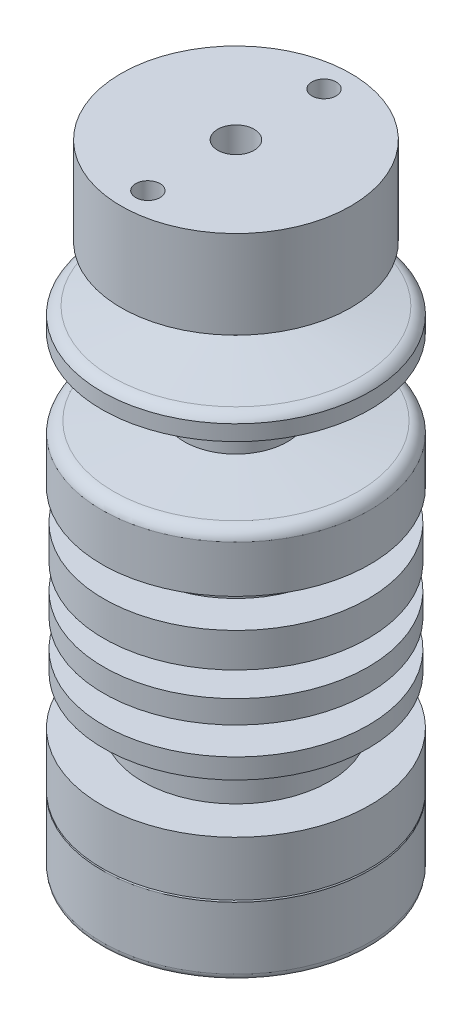
ISO-10303-21;
HEADER;
FILE_DESCRIPTION(('STEP AP214'),'2;1');
FILE_NAME('part.step','',(''),(''),'','','');
FILE_SCHEMA(('AUTOMOTIVE_DESIGN { 1 0 10303 214 1 1 1 1 }'));
ENDSEC;
DATA;
#1=APPLICATION_CONTEXT('core data for automotive mechanical design processes');
#2=APPLICATION_PROTOCOL_DEFINITION('international standard','automotive_design',2000,#1);
#3=PRODUCT_CONTEXT('',#1,'mechanical');
#4=PRODUCT('Part','Part','',(#3));
#5=PRODUCT_RELATED_PRODUCT_CATEGORY('part','',(#4));
#6=PRODUCT_DEFINITION_FORMATION('','',#4);
#7=PRODUCT_DEFINITION_CONTEXT('part definition',#1,'design');
#8=PRODUCT_DEFINITION('design','',#6,#7);
#9=PRODUCT_DEFINITION_SHAPE('','',#8);
#10=(LENGTH_UNIT() NAMED_UNIT(*) SI_UNIT(.MILLI.,.METRE.));
#11=(NAMED_UNIT(*) PLANE_ANGLE_UNIT() SI_UNIT($,.RADIAN.));
#12=(NAMED_UNIT(*) SI_UNIT($,.STERADIAN.) SOLID_ANGLE_UNIT());
#13=UNCERTAINTY_MEASURE_WITH_UNIT(LENGTH_MEASURE(1.E-05),#10,'distance_accuracy_value','');
#14=(GEOMETRIC_REPRESENTATION_CONTEXT(3) GLOBAL_UNCERTAINTY_ASSIGNED_CONTEXT((#13)) GLOBAL_UNIT_ASSIGNED_CONTEXT((#10,
#11,#12)) REPRESENTATION_CONTEXT('',''));
#15=CARTESIAN_POINT('',(0.,0.,0.));
#16=DIRECTION('',(0.,0.,1.));
#17=DIRECTION('',(1.,0.,0.));
#18=AXIS2_PLACEMENT_3D('',#15,#16,#17);
#19=CARTESIAN_POINT('',(0.,43.0445682451364,0.));
#20=DIRECTION('',(0.,-1.,0.));
#21=DIRECTION('',(1.,0.,0.));
#22=AXIS2_PLACEMENT_3D('',#19,#20,#21);
#23=PLANE('',#22);
#24=CARTESIAN_POINT('',(0.,43.0445682451364,0.));
#25=DIRECTION('',(0.,1.,0.));
#26=DIRECTION('',(-1.,0.,0.));
#27=AXIS2_PLACEMENT_3D('',#24,#25,#26);
#28=CIRCLE('',#27,4.765);
#29=CARTESIAN_POINT('',(-4.765,43.0445682451364,0.));
#30=VERTEX_POINT('',#29);
#31=EDGE_CURVE('E119',#30,#30,#28,.T.);
#32=ORIENTED_EDGE('',*,*,#31,.F.);
#33=EDGE_LOOP('',(#32));
#34=FACE_BOUND('',#33,.T.);
#35=CARTESIAN_POINT('',(0.,43.0445682451364,23.));
#36=DIRECTION('',(0.,1.,0.));
#37=DIRECTION('',(-1.,0.,0.));
#38=AXIS2_PLACEMENT_3D('',#35,#36,#37);
#39=CIRCLE('',#38,3.175);
#40=CARTESIAN_POINT('',(-3.17500000000001,43.0445682451364,23.));
#41=VERTEX_POINT('',#40);
#42=EDGE_CURVE('E123',#41,#41,#39,.T.);
#43=ORIENTED_EDGE('',*,*,#42,.F.);
#44=EDGE_LOOP('',(#43));
#45=FACE_BOUND('',#44,.T.);
#46=CARTESIAN_POINT('',(0.,43.0445682451364,-23.));
#47=DIRECTION('',(0.,1.,0.));
#48=DIRECTION('',(-1.,0.,0.));
#49=AXIS2_PLACEMENT_3D('',#46,#47,#48);
#50=CIRCLE('',#49,3.175);
#51=CARTESIAN_POINT('',(-3.17500000000001,43.0445682451364,-23.));
#52=VERTEX_POINT('',#51);
#53=EDGE_CURVE('E126',#52,#52,#50,.T.);
#54=ORIENTED_EDGE('',*,*,#53,.F.);
#55=EDGE_LOOP('',(#54));
#56=FACE_BOUND('',#55,.T.);
#57=CARTESIAN_POINT('',(0.,43.0445682451364,0.));
#58=DIRECTION('',(0.,1.,0.));
#59=DIRECTION('',(-1.,0.,0.));
#60=AXIS2_PLACEMENT_3D('',#57,#58,#59);
#61=CIRCLE('',#60,30.);
#62=CARTESIAN_POINT('',(-30.,43.0445682451364,0.));
#63=VERTEX_POINT('',#62);
#64=EDGE_CURVE('E10',#63,#63,#61,.T.);
#65=ORIENTED_EDGE('',*,*,#64,.T.);
#66=EDGE_LOOP('',(#65));
#67=FACE_BOUND('',#66,.T.);
#68=ADVANCED_FACE('F33',(#34,#45,#56,#67),#23,.F.);
#69=CARTESIAN_POINT('',(0.,43.0445682451364,0.));
#70=DIRECTION('',(0.,1.,0.));
#71=DIRECTION('',(-1.,0.,0.));
#72=AXIS2_PLACEMENT_3D('',#69,#70,#71);
#73=CYLINDRICAL_SURFACE('',#72,30.);
#74=ORIENTED_EDGE('',*,*,#64,.F.);
#75=EDGE_LOOP('',(#74));
#76=FACE_BOUND('',#75,.T.);
#77=CARTESIAN_POINT('',(0.,20.0445682451364,0.));
#78=DIRECTION('',(0.,1.,0.));
#79=DIRECTION('',(-1.,0.,0.));
#80=AXIS2_PLACEMENT_3D('',#77,#78,#79);
#81=CIRCLE('',#80,30.);
#82=CARTESIAN_POINT('',(-30.,20.0445682451364,0.));
#83=VERTEX_POINT('',#82);
#84=EDGE_CURVE('E40',#83,#83,#81,.T.);
#85=ORIENTED_EDGE('',*,*,#84,.T.);
#86=EDGE_LOOP('',(#85));
#87=FACE_BOUND('',#86,.T.);
#88=ADVANCED_FACE('F109',(#76,#87),#73,.T.);
#89=CARTESIAN_POINT('',(30.,20.0445682451364,0.));
#90=DIRECTION('',(0.,1.,0.));
#91=DIRECTION('',(-1.,0.,0.));
#92=AXIS2_PLACEMENT_3D('',#89,#90,#91);
#93=PLANE('',#92);
#94=ORIENTED_EDGE('',*,*,#84,.F.);
#95=EDGE_LOOP('',(#94));
#96=FACE_BOUND('',#95,.T.);
#97=CARTESIAN_POINT('',(0.,20.0445682451364,0.));
#98=DIRECTION('',(0.,1.,0.));
#99=DIRECTION('',(-1.,0.,0.));
#100=AXIS2_PLACEMENT_3D('',#97,#98,#99);
#101=CIRCLE('',#100,12.9857969124329);
#102=CARTESIAN_POINT('',(-12.9857969124329,20.0445682451364,0.));
#103=VERTEX_POINT('',#102);
#104=EDGE_CURVE('E45',#103,#103,#101,.T.);
#105=ORIENTED_EDGE('',*,*,#104,.T.);
#106=EDGE_LOOP('',(#105));
#107=FACE_BOUND('',#106,.T.);
#108=ADVANCED_FACE('F114',(#96,#107),#93,.F.);
#109=CARTESIAN_POINT('',(0.,43.0445682451364,0.));
#110=DIRECTION('',(0.,1.,0.));
#111=DIRECTION('',(-1.,0.,0.));
#112=AXIS2_PLACEMENT_3D('',#109,#110,#111);
#113=CYLINDRICAL_SURFACE('',#112,12.9857969124329);
#114=ORIENTED_EDGE('',*,*,#104,.F.);
#115=EDGE_LOOP('',(#114));
#116=FACE_BOUND('',#115,.T.);
#117=CARTESIAN_POINT('',(0.,10.4062076007876,0.));
#118=DIRECTION('',(0.,1.,0.));
#119=DIRECTION('',(-1.,0.,0.));
#120=AXIS2_PLACEMENT_3D('',#117,#118,#119);
#121=CIRCLE('',#120,12.9857969124329);
#122=CARTESIAN_POINT('',(-12.9857969124329,10.4062076007876,0.));
#123=VERTEX_POINT('',#122);
#124=EDGE_CURVE('E216',#123,#123,#121,.T.);
#125=ORIENTED_EDGE('',*,*,#124,.T.);
#126=EDGE_LOOP('',(#125));
#127=FACE_BOUND('',#126,.T.);
#128=ADVANCED_FACE('F222',(#116,#127),#113,.T.);
#129=CARTESIAN_POINT('',(0.,10.4062076007876,0.));
#130=DIRECTION('',(0.,1.,0.));
#131=DIRECTION('',(-1.,0.,0.));
#132=AXIS2_PLACEMENT_3D('',#129,#130,#131);
#133=TOROIDAL_SURFACE('',#132,15.8008154382432,2.81501852581031);
#134=ORIENTED_EDGE('',*,*,#124,.F.);
#135=EDGE_LOOP('',(#134));
#136=FACE_BOUND('',#135,.T.);
#137=CARTESIAN_POINT('',(0.,8.51251271153448,0.));
#138=DIRECTION('',(0.,1.,0.));
#139=DIRECTION('',(-1.,0.,0.));
#140=AXIS2_PLACEMENT_3D('',#137,#138,#139);
#141=CIRCLE('',#140,13.7179690763931);
#142=CARTESIAN_POINT('',(-13.7179690763931,8.51251271153447,0.));
#143=VERTEX_POINT('',#142);
#144=EDGE_CURVE('E213',#143,#143,#141,.T.);
#145=ORIENTED_EDGE('',*,*,#144,.T.);
#146=EDGE_LOOP('',(#145));
#147=FACE_BOUND('',#146,.T.);
#148=ADVANCED_FACE('F225',(#136,#147),#133,.F.);
#149=CARTESIAN_POINT('',(0.,5.48596194522862,0.));
#150=DIRECTION('',(0.,-1.,0.));
#151=DIRECTION('',(1.,0.,0.));
#152=AXIS2_PLACEMENT_3D('',#149,#150,#151);
#153=CONICAL_SURFACE('',#152,32.3097448153254,1.40942212691776);
#154=ORIENTED_EDGE('',*,*,#144,.F.);
#155=EDGE_LOOP('',(#154));
#156=FACE_BOUND('',#155,.T.);
#157=CARTESIAN_POINT('',(0.,5.48596194522862,0.));
#158=DIRECTION('',(0.,1.,0.));
#159=DIRECTION('',(-1.,0.,0.));
#160=AXIS2_PLACEMENT_3D('',#157,#158,#159);
#161=CIRCLE('',#160,32.3097448153254);
#162=CARTESIAN_POINT('',(-32.3097448153254,5.48596194522862,0.));
#163=VERTEX_POINT('',#162);
#164=EDGE_CURVE('E210',#163,#163,#161,.T.);
#165=ORIENTED_EDGE('',*,*,#164,.T.);
#166=EDGE_LOOP('',(#165));
#167=FACE_BOUND('',#166,.T.);
#168=ADVANCED_FACE('F231',(#156,#167),#153,.T.);
#169=CARTESIAN_POINT('',(0.,1.82897337850735,0.));
#170=DIRECTION('',(0.,1.,0.));
#171=DIRECTION('',(-1.,0.,0.));
#172=AXIS2_PLACEMENT_3D('',#169,#170,#171);
#173=TOROIDAL_SURFACE('',#172,31.714424513252,3.7051277493753);
#174=ORIENTED_EDGE('',*,*,#164,.F.);
#175=EDGE_LOOP('',(#174));
#176=FACE_BOUND('',#175,.T.);
#177=CARTESIAN_POINT('',(0.,3.54156362724511,0.));
#178=DIRECTION('',(0.,1.,0.));
#179=DIRECTION('',(-1.,0.,0.));
#180=AXIS2_PLACEMENT_3D('',#177,#178,#179);
#181=CIRCLE('',#180,35.);
#182=CARTESIAN_POINT('',(-35.,3.54156362724511,0.));
#183=VERTEX_POINT('',#182);
#184=EDGE_CURVE('E207',#183,#183,#181,.T.);
#185=ORIENTED_EDGE('',*,*,#184,.T.);
#186=EDGE_LOOP('',(#185));
#187=FACE_BOUND('',#186,.T.);
#188=ADVANCED_FACE('F237',(#176,#187),#173,.T.);
#189=CARTESIAN_POINT('',(0.,43.0445682451364,0.));
#190=DIRECTION('',(0.,1.,0.));
#191=DIRECTION('',(-1.,0.,0.));
#192=AXIS2_PLACEMENT_3D('',#189,#190,#191);
#193=CYLINDRICAL_SURFACE('',#192,35.);
#194=ORIENTED_EDGE('',*,*,#184,.F.);
#195=EDGE_LOOP('',(#194));
#196=FACE_BOUND('',#195,.T.);
#197=CARTESIAN_POINT('',(0.,-0.490098714239634,0.));
#198=DIRECTION('',(0.,1.,0.));
#199=DIRECTION('',(-1.,0.,0.));
#200=AXIS2_PLACEMENT_3D('',#197,#198,#199);
#201=CIRCLE('',#200,35.);
#202=CARTESIAN_POINT('',(-35.,-0.490098714239638,0.));
#203=VERTEX_POINT('',#202);
#204=EDGE_CURVE('E204',#203,#203,#201,.T.);
#205=ORIENTED_EDGE('',*,*,#204,.T.);
#206=EDGE_LOOP('',(#205));
#207=FACE_BOUND('',#206,.T.);
#208=ADVANCED_FACE('F243',(#196,#207),#193,.T.);
#209=CARTESIAN_POINT('',(13.4687354882585,-0.490098714239631,0.));
#210=DIRECTION('',(0.,1.,0.));
#211=DIRECTION('',(-1.,0.,0.));
#212=AXIS2_PLACEMENT_3D('',#209,#210,#211);
#213=PLANE('',#212);
#214=ORIENTED_EDGE('',*,*,#204,.F.);
#215=EDGE_LOOP('',(#214));
#216=FACE_BOUND('',#215,.T.);
#217=CARTESIAN_POINT('',(0.,-0.490098714239634,0.));
#218=DIRECTION('',(0.,1.,0.));
#219=DIRECTION('',(-1.,0.,0.));
#220=AXIS2_PLACEMENT_3D('',#217,#218,#219);
#221=CIRCLE('',#220,13.4687354882585);
#222=CARTESIAN_POINT('',(-13.4687354882585,-0.490098714239636,0.));
#223=VERTEX_POINT('',#222);
#224=EDGE_CURVE('E201',#223,#223,#221,.T.);
#225=ORIENTED_EDGE('',*,*,#224,.T.);
#226=EDGE_LOOP('',(#225));
#227=FACE_BOUND('',#226,.T.);
#228=ADVANCED_FACE('F249',(#216,#227),#213,.F.);
#229=CARTESIAN_POINT('',(0.,43.0445682451364,0.));
#230=DIRECTION('',(0.,1.,0.));
#231=DIRECTION('',(-1.,0.,0.));
#232=AXIS2_PLACEMENT_3D('',#229,#230,#231);
#233=CYLINDRICAL_SURFACE('',#232,13.4687354882585);
#234=ORIENTED_EDGE('',*,*,#224,.F.);
#235=EDGE_LOOP('',(#234));
#236=FACE_BOUND('',#235,.T.);
#237=CARTESIAN_POINT('',(0.,-18.538757945872,0.));
#238=DIRECTION('',(0.,1.,0.));
#239=DIRECTION('',(-1.,0.,0.));
#240=AXIS2_PLACEMENT_3D('',#237,#238,#239);
#241=CIRCLE('',#240,13.4687354882585);
#242=CARTESIAN_POINT('',(-13.4687354882585,-18.538757945872,0.));
#243=VERTEX_POINT('',#242);
#244=EDGE_CURVE('E198',#243,#243,#241,.T.);
#245=ORIENTED_EDGE('',*,*,#244,.T.);
#246=EDGE_LOOP('',(#245));
#247=FACE_BOUND('',#246,.T.);
#248=ADVANCED_FACE('F255',(#236,#247),#233,.T.);
#249=CARTESIAN_POINT('',(0.,-20.5131962872159,0.));
#250=DIRECTION('',(0.,-1.,0.));
#251=DIRECTION('',(1.,0.,0.));
#252=AXIS2_PLACEMENT_3D('',#249,#250,#251);
#253=CONICAL_SURFACE('',#252,31.9792266270137,1.46453221422253);
#254=ORIENTED_EDGE('',*,*,#244,.F.);
#255=EDGE_LOOP('',(#254));
#256=FACE_BOUND('',#255,.T.);
#257=CARTESIAN_POINT('',(0.,-20.5131962872159,0.));
#258=DIRECTION('',(0.,1.,0.));
#259=DIRECTION('',(-1.,0.,0.));
#260=AXIS2_PLACEMENT_3D('',#257,#258,#259);
#261=CIRCLE('',#260,31.9792266270137);
#262=CARTESIAN_POINT('',(-31.9792266270137,-20.5131962872159,0.));
#263=VERTEX_POINT('',#262);
#264=EDGE_CURVE('E195',#263,#263,#261,.T.);
#265=ORIENTED_EDGE('',*,*,#264,.T.);
#266=EDGE_LOOP('',(#265));
#267=FACE_BOUND('',#266,.T.);
#268=ADVANCED_FACE('F261',(#256,#267),#253,.T.);
#269=CARTESIAN_POINT('',(0.,-23.9615059492109,0.));
#270=DIRECTION('',(0.,1.,0.));
#271=DIRECTION('',(-1.,0.,0.));
#272=AXIS2_PLACEMENT_3D('',#269,#270,#271);
#273=TOROIDAL_SURFACE('',#272,31.6114095465033,3.46787095055789);
#274=ORIENTED_EDGE('',*,*,#264,.F.);
#275=EDGE_LOOP('',(#274));
#276=FACE_BOUND('',#275,.T.);
#277=CARTESIAN_POINT('',(0.,-23.2242246811764,0.));
#278=DIRECTION('',(0.,1.,0.));
#279=DIRECTION('',(-1.,0.,0.));
#280=AXIS2_PLACEMENT_3D('',#277,#278,#279);
#281=CIRCLE('',#280,35.);
#282=CARTESIAN_POINT('',(-35.,-23.2242246811764,0.));
#283=VERTEX_POINT('',#282);
#284=EDGE_CURVE('E192',#283,#283,#281,.T.);
#285=ORIENTED_EDGE('',*,*,#284,.T.);
#286=EDGE_LOOP('',(#285));
#287=FACE_BOUND('',#286,.T.);
#288=ADVANCED_FACE('F267',(#276,#287),#273,.T.);
#289=CARTESIAN_POINT('',(0.,43.0445682451364,0.));
#290=DIRECTION('',(0.,1.,0.));
#291=DIRECTION('',(-1.,0.,0.));
#292=AXIS2_PLACEMENT_3D('',#289,#290,#291);
#293=CYLINDRICAL_SURFACE('',#292,35.);
#294=ORIENTED_EDGE('',*,*,#284,.F.);
#295=EDGE_LOOP('',(#294));
#296=FACE_BOUND('',#295,.T.);
#297=CARTESIAN_POINT('',(0.,-35.501069654203,0.));
#298=DIRECTION('',(0.,1.,0.));
#299=DIRECTION('',(-1.,0.,0.));
#300=AXIS2_PLACEMENT_3D('',#297,#298,#299);
#301=CIRCLE('',#300,35.);
#302=CARTESIAN_POINT('',(-35.,-35.501069654203,0.));
#303=VERTEX_POINT('',#302);
#304=EDGE_CURVE('E189',#303,#303,#301,.T.);
#305=ORIENTED_EDGE('',*,*,#304,.T.);
#306=EDGE_LOOP('',(#305));
#307=FACE_BOUND('',#306,.T.);
#308=ADVANCED_FACE('F273',(#296,#307),#293,.T.);
#309=CARTESIAN_POINT('',(35.,-35.501069654203,0.));
#310=DIRECTION('',(0.,1.,0.));
#311=DIRECTION('',(-1.,0.,0.));
#312=AXIS2_PLACEMENT_3D('',#309,#310,#311);
#313=PLANE('',#312);
#314=ORIENTED_EDGE('',*,*,#304,.F.);
#315=EDGE_LOOP('',(#314));
#316=FACE_BOUND('',#315,.T.);
#317=CARTESIAN_POINT('',(0.,-35.501069654203,0.));
#318=DIRECTION('',(0.,1.,0.));
#319=DIRECTION('',(-1.,0.,0.));
#320=AXIS2_PLACEMENT_3D('',#317,#318,#319);
#321=CIRCLE('',#320,24.3346955919766);
#322=CARTESIAN_POINT('',(-24.3346955919766,-35.501069654203,0.));
#323=VERTEX_POINT('',#322);
#324=EDGE_CURVE('E186',#323,#323,#321,.T.);
#325=ORIENTED_EDGE('',*,*,#324,.T.);
#326=EDGE_LOOP('',(#325));
#327=FACE_BOUND('',#326,.T.);
#328=ADVANCED_FACE('F279',(#316,#327),#313,.F.);
#329=CARTESIAN_POINT('',(0.,43.0445682451364,0.));
#330=DIRECTION('',(0.,1.,0.));
#331=DIRECTION('',(-1.,0.,0.));
#332=AXIS2_PLACEMENT_3D('',#329,#330,#331);
#333=CYLINDRICAL_SURFACE('',#332,24.3346955919766);
#334=ORIENTED_EDGE('',*,*,#324,.F.);
#335=EDGE_LOOP('',(#334));
#336=FACE_BOUND('',#335,.T.);
#337=CARTESIAN_POINT('',(0.,-43.5201302921998,0.));
#338=DIRECTION('',(0.,1.,0.));
#339=DIRECTION('',(-1.,0.,0.));
#340=AXIS2_PLACEMENT_3D('',#337,#338,#339);
#341=CIRCLE('',#340,24.3346955919766);
#342=CARTESIAN_POINT('',(-24.3346955919766,-43.5201302921998,0.));
#343=VERTEX_POINT('',#342);
#344=EDGE_CURVE('E183',#343,#343,#341,.T.);
#345=ORIENTED_EDGE('',*,*,#344,.T.);
#346=EDGE_LOOP('',(#345));
#347=FACE_BOUND('',#346,.T.);
#348=ADVANCED_FACE('F285',(#336,#347),#333,.T.);
#349=CARTESIAN_POINT('',(34.5383420831025,-43.5201302921998,0.));
#350=DIRECTION('',(0.,-1.,0.));
#351=DIRECTION('',(1.,0.,0.));
#352=AXIS2_PLACEMENT_3D('',#349,#350,#351);
#353=PLANE('',#352);
#354=ORIENTED_EDGE('',*,*,#344,.F.);
#355=EDGE_LOOP('',(#354));
#356=FACE_BOUND('',#355,.T.);
#357=CARTESIAN_POINT('',(0.,-43.5201302921998,0.));
#358=DIRECTION('',(0.,1.,0.));
#359=DIRECTION('',(-1.,0.,0.));
#360=AXIS2_PLACEMENT_3D('',#357,#358,#359);
#361=CIRCLE('',#360,34.5383420831025);
#362=CARTESIAN_POINT('',(-34.5383420831025,-43.5201302921998,0.));
#363=VERTEX_POINT('',#362);
#364=EDGE_CURVE('E180',#363,#363,#361,.T.);
#365=ORIENTED_EDGE('',*,*,#364,.T.);
#366=EDGE_LOOP('',(#365));
#367=FACE_BOUND('',#366,.T.);
#368=ADVANCED_FACE('F291',(#356,#367),#353,.F.);
#369=CARTESIAN_POINT('',(0.,43.0445682451364,0.));
#370=DIRECTION('',(0.,1.,0.));
#371=DIRECTION('',(-1.,0.,0.));
#372=AXIS2_PLACEMENT_3D('',#369,#370,#371);
#373=CYLINDRICAL_SURFACE('',#372,34.5383420831025);
#374=ORIENTED_EDGE('',*,*,#364,.F.);
#375=EDGE_LOOP('',(#374));
#376=FACE_BOUND('',#375,.T.);
#377=CARTESIAN_POINT('',(0.,-52.4771427984482,0.));
#378=DIRECTION('',(0.,1.,0.));
#379=DIRECTION('',(-1.,0.,0.));
#380=AXIS2_PLACEMENT_3D('',#377,#378,#379);
#381=CIRCLE('',#380,34.5383420831025);
#382=CARTESIAN_POINT('',(-34.5383420831025,-52.4771427984482,0.));
#383=VERTEX_POINT('',#382);
#384=EDGE_CURVE('E177',#383,#383,#381,.T.);
#385=ORIENTED_EDGE('',*,*,#384,.T.);
#386=EDGE_LOOP('',(#385));
#387=FACE_BOUND('',#386,.T.);
#388=ADVANCED_FACE('F297',(#376,#387),#373,.T.);
#389=CARTESIAN_POINT('',(24.3346955919766,-52.4771427984482,0.));
#390=DIRECTION('',(0.,1.,0.));
#391=DIRECTION('',(-1.,0.,0.));
#392=AXIS2_PLACEMENT_3D('',#389,#390,#391);
#393=PLANE('',#392);
#394=ORIENTED_EDGE('',*,*,#384,.F.);
#395=EDGE_LOOP('',(#394));
#396=FACE_BOUND('',#395,.T.);
#397=CARTESIAN_POINT('',(0.,-52.4771427984482,0.));
#398=DIRECTION('',(0.,1.,0.));
#399=DIRECTION('',(-1.,0.,0.));
#400=AXIS2_PLACEMENT_3D('',#397,#398,#399);
#401=CIRCLE('',#400,24.3346955919766);
#402=CARTESIAN_POINT('',(-24.3346955919766,-52.4771427984482,0.));
#403=VERTEX_POINT('',#402);
#404=EDGE_CURVE('E174',#403,#403,#401,.T.);
#405=ORIENTED_EDGE('',*,*,#404,.T.);
#406=EDGE_LOOP('',(#405));
#407=FACE_BOUND('',#406,.T.);
#408=ADVANCED_FACE('F303',(#396,#407),#393,.F.);
#409=CARTESIAN_POINT('',(0.,43.0445682451364,0.));
#410=DIRECTION('',(0.,1.,0.));
#411=DIRECTION('',(-1.,0.,0.));
#412=AXIS2_PLACEMENT_3D('',#409,#410,#411);
#413=CYLINDRICAL_SURFACE('',#412,24.3346955919766);
#414=ORIENTED_EDGE('',*,*,#404,.F.);
#415=EDGE_LOOP('',(#414));
#416=FACE_BOUND('',#415,.T.);
#417=CARTESIAN_POINT('',(0.,-58.9460962751831,0.));
#418=DIRECTION('',(0.,1.,0.));
#419=DIRECTION('',(-1.,0.,0.));
#420=AXIS2_PLACEMENT_3D('',#417,#418,#419);
#421=CIRCLE('',#420,24.3346955919766);
#422=CARTESIAN_POINT('',(-24.3346955919766,-58.9460962751831,0.));
#423=VERTEX_POINT('',#422);
#424=EDGE_CURVE('E171',#423,#423,#421,.T.);
#425=ORIENTED_EDGE('',*,*,#424,.T.);
#426=EDGE_LOOP('',(#425));
#427=FACE_BOUND('',#426,.T.);
#428=ADVANCED_FACE('F309',(#416,#427),#413,.T.);
#429=CARTESIAN_POINT('',(34.5383420831025,-58.9460962751831,0.));
#430=DIRECTION('',(0.,-1.,0.));
#431=DIRECTION('',(1.,0.,0.));
#432=AXIS2_PLACEMENT_3D('',#429,#430,#431);
#433=PLANE('',#432);
#434=ORIENTED_EDGE('',*,*,#424,.F.);
#435=EDGE_LOOP('',(#434));
#436=FACE_BOUND('',#435,.T.);
#437=CARTESIAN_POINT('',(0.,-58.9460962751831,0.));
#438=DIRECTION('',(0.,1.,0.));
#439=DIRECTION('',(-1.,0.,0.));
#440=AXIS2_PLACEMENT_3D('',#437,#438,#439);
#441=CIRCLE('',#440,34.5383420831025);
#442=CARTESIAN_POINT('',(-34.5383420831025,-58.9460962751831,0.));
#443=VERTEX_POINT('',#442);
#444=EDGE_CURVE('E168',#443,#443,#441,.T.);
#445=ORIENTED_EDGE('',*,*,#444,.T.);
#446=EDGE_LOOP('',(#445));
#447=FACE_BOUND('',#446,.T.);
#448=ADVANCED_FACE('F315',(#436,#447),#433,.F.);
#449=CARTESIAN_POINT('',(0.,43.0445682451364,0.));
#450=DIRECTION('',(0.,1.,0.));
#451=DIRECTION('',(-1.,0.,0.));
#452=AXIS2_PLACEMENT_3D('',#449,#450,#451);
#453=CYLINDRICAL_SURFACE('',#452,34.5383420831025);
#454=ORIENTED_EDGE('',*,*,#444,.F.);
#455=EDGE_LOOP('',(#454));
#456=FACE_BOUND('',#455,.T.);
#457=CARTESIAN_POINT('',(0.,-64.9174379460154,0.));
#458=DIRECTION('',(0.,1.,0.));
#459=DIRECTION('',(-1.,0.,0.));
#460=AXIS2_PLACEMENT_3D('',#457,#458,#459);
#461=CIRCLE('',#460,34.5383420831025);
#462=CARTESIAN_POINT('',(-34.5383420831025,-64.9174379460154,0.));
#463=VERTEX_POINT('',#462);
#464=EDGE_CURVE('E165',#463,#463,#461,.T.);
#465=ORIENTED_EDGE('',*,*,#464,.T.);
#466=EDGE_LOOP('',(#465));
#467=FACE_BOUND('',#466,.T.);
#468=ADVANCED_FACE('F321',(#456,#467),#453,.T.);
#469=CARTESIAN_POINT('',(24.3346955919766,-64.9174379460154,0.));
#470=DIRECTION('',(0.,1.,0.));
#471=DIRECTION('',(-1.,0.,0.));
#472=AXIS2_PLACEMENT_3D('',#469,#470,#471);
#473=PLANE('',#472);
#474=ORIENTED_EDGE('',*,*,#464,.F.);
#475=EDGE_LOOP('',(#474));
#476=FACE_BOUND('',#475,.T.);
#477=CARTESIAN_POINT('',(0.,-64.9174379460154,0.));
#478=DIRECTION('',(0.,1.,0.));
#479=DIRECTION('',(-1.,0.,0.));
#480=AXIS2_PLACEMENT_3D('',#477,#478,#479);
#481=CIRCLE('',#480,24.3346955919766);
#482=CARTESIAN_POINT('',(-24.3346955919766,-64.9174379460154,0.));
#483=VERTEX_POINT('',#482);
#484=EDGE_CURVE('E162',#483,#483,#481,.T.);
#485=ORIENTED_EDGE('',*,*,#484,.T.);
#486=EDGE_LOOP('',(#485));
#487=FACE_BOUND('',#486,.T.);
#488=ADVANCED_FACE('F327',(#476,#487),#473,.F.);
#489=CARTESIAN_POINT('',(0.,43.0445682451364,0.));
#490=DIRECTION('',(0.,1.,0.));
#491=DIRECTION('',(-1.,0.,0.));
#492=AXIS2_PLACEMENT_3D('',#489,#490,#491);
#493=CYLINDRICAL_SURFACE('',#492,24.3346955919766);
#494=ORIENTED_EDGE('',*,*,#484,.F.);
#495=EDGE_LOOP('',(#494));
#496=FACE_BOUND('',#495,.T.);
#497=CARTESIAN_POINT('',(0.,-72.1328091316043,0.));
#498=DIRECTION('',(0.,1.,0.));
#499=DIRECTION('',(-1.,0.,0.));
#500=AXIS2_PLACEMENT_3D('',#497,#498,#499);
#501=CIRCLE('',#500,24.3346955919766);
#502=CARTESIAN_POINT('',(-24.3346955919766,-72.1328091316043,0.));
#503=VERTEX_POINT('',#502);
#504=EDGE_CURVE('E159',#503,#503,#501,.T.);
#505=ORIENTED_EDGE('',*,*,#504,.T.);
#506=EDGE_LOOP('',(#505));
#507=FACE_BOUND('',#506,.T.);
#508=ADVANCED_FACE('F333',(#496,#507),#493,.T.);
#509=CARTESIAN_POINT('',(34.5383420831025,-72.1328091316043,0.));
#510=DIRECTION('',(0.,-1.,0.));
#511=DIRECTION('',(1.,0.,0.));
#512=AXIS2_PLACEMENT_3D('',#509,#510,#511);
#513=PLANE('',#512);
#514=ORIENTED_EDGE('',*,*,#504,.F.);
#515=EDGE_LOOP('',(#514));
#516=FACE_BOUND('',#515,.T.);
#517=CARTESIAN_POINT('',(0.,-72.1328091316043,0.));
#518=DIRECTION('',(0.,1.,0.));
#519=DIRECTION('',(-1.,0.,0.));
#520=AXIS2_PLACEMENT_3D('',#517,#518,#519);
#521=CIRCLE('',#520,34.5383420831025);
#522=CARTESIAN_POINT('',(-34.5383420831025,-72.1328091316043,0.));
#523=VERTEX_POINT('',#522);
#524=EDGE_CURVE('E156',#523,#523,#521,.T.);
#525=ORIENTED_EDGE('',*,*,#524,.T.);
#526=EDGE_LOOP('',(#525));
#527=FACE_BOUND('',#526,.T.);
#528=ADVANCED_FACE('F339',(#516,#527),#513,.F.);
#529=CARTESIAN_POINT('',(0.,43.0445682451364,0.));
#530=DIRECTION('',(0.,1.,0.));
#531=DIRECTION('',(-1.,0.,0.));
#532=AXIS2_PLACEMENT_3D('',#529,#530,#531);
#533=CYLINDRICAL_SURFACE('',#532,34.5383420831025);
#534=ORIENTED_EDGE('',*,*,#524,.F.);
#535=EDGE_LOOP('',(#534));
#536=FACE_BOUND('',#535,.T.);
#537=CARTESIAN_POINT('',(0.,-77.3577330935826,0.));
#538=DIRECTION('',(0.,1.,0.));
#539=DIRECTION('',(-1.,0.,0.));
#540=AXIS2_PLACEMENT_3D('',#537,#538,#539);
#541=CIRCLE('',#540,34.5383420831025);
#542=CARTESIAN_POINT('',(-34.5383420831025,-77.3577330935826,0.));
#543=VERTEX_POINT('',#542);
#544=EDGE_CURVE('E153',#543,#543,#541,.T.);
#545=ORIENTED_EDGE('',*,*,#544,.T.);
#546=EDGE_LOOP('',(#545));
#547=FACE_BOUND('',#546,.T.);
#548=ADVANCED_FACE('F345',(#536,#547),#533,.T.);
#549=CARTESIAN_POINT('',(24.3346955919766,-77.3577330935826,0.));
#550=DIRECTION('',(0.,1.,0.));
#551=DIRECTION('',(-1.,0.,0.));
#552=AXIS2_PLACEMENT_3D('',#549,#550,#551);
#553=PLANE('',#552);
#554=ORIENTED_EDGE('',*,*,#544,.F.);
#555=EDGE_LOOP('',(#554));
#556=FACE_BOUND('',#555,.T.);
#557=CARTESIAN_POINT('',(0.,-77.3577330935826,0.));
#558=DIRECTION('',(0.,1.,0.));
#559=DIRECTION('',(-1.,0.,0.));
#560=AXIS2_PLACEMENT_3D('',#557,#558,#559);
#561=CIRCLE('',#560,24.3346955919766);
#562=CARTESIAN_POINT('',(-24.3346955919766,-77.3577330935826,0.));
#563=VERTEX_POINT('',#562);
#564=EDGE_CURVE('E150',#563,#563,#561,.T.);
#565=ORIENTED_EDGE('',*,*,#564,.T.);
#566=EDGE_LOOP('',(#565));
#567=FACE_BOUND('',#566,.T.);
#568=ADVANCED_FACE('F351',(#556,#567),#553,.F.);
#569=CARTESIAN_POINT('',(0.,43.0445682451364,0.));
#570=DIRECTION('',(0.,1.,0.));
#571=DIRECTION('',(-1.,0.,0.));
#572=AXIS2_PLACEMENT_3D('',#569,#570,#571);
#573=CYLINDRICAL_SURFACE('',#572,24.3346955919766);
#574=CARTESIAN_POINT('',(0.,-89.9816680736034,0.));
#575=DIRECTION('',(0.,1.,0.));
#576=DIRECTION('',(-1.,0.,0.));
#577=AXIS2_PLACEMENT_3D('',#574,#575,#576);
#578=CIRCLE('',#577,24.3346955919766);
#579=CARTESIAN_POINT('',(-24.3346955919766,-89.9816680736034,0.));
#580=VERTEX_POINT('',#579);
#581=EDGE_CURVE('E36',#580,#580,#578,.T.);
#582=ORIENTED_EDGE('',*,*,#581,.T.);
#583=EDGE_LOOP('',(#582));
#584=FACE_BOUND('',#583,.T.);
#585=ORIENTED_EDGE('',*,*,#564,.F.);
#586=EDGE_LOOP('',(#585));
#587=FACE_BOUND('',#586,.T.);
#588=ADVANCED_FACE('F73',(#584,#587),#573,.T.);
#589=CARTESIAN_POINT('',(0.,25.0445682451364,-23.));
#590=DIRECTION('',(0.,1.,0.));
#591=DIRECTION('',(-1.,0.,0.));
#592=AXIS2_PLACEMENT_3D('',#589,#590,#591);
#593=CYLINDRICAL_SURFACE('',#592,3.175);
#594=CARTESIAN_POINT('',(0.,25.0445682451364,-23.));
#595=DIRECTION('',(0.,1.,0.));
#596=DIRECTION('',(-1.,0.,0.));
#597=AXIS2_PLACEMENT_3D('',#594,#595,#596);
#598=CIRCLE('',#597,3.175);
#599=CARTESIAN_POINT('',(-3.175,25.0445682451364,-23.));
#600=VERTEX_POINT('',#599);
#601=EDGE_CURVE('E128',#600,#600,#598,.T.);
#602=ORIENTED_EDGE('',*,*,#601,.F.);
#603=EDGE_LOOP('',(#602));
#604=FACE_BOUND('',#603,.T.);
#605=ORIENTED_EDGE('',*,*,#53,.T.);
#606=EDGE_LOOP('',(#605));
#607=FACE_BOUND('',#606,.T.);
#608=ADVANCED_FACE('F69',(#604,#607),#593,.F.);
#609=CARTESIAN_POINT('',(0.,25.0445682451364,-23.));
#610=DIRECTION('',(0.,1.,0.));
#611=DIRECTION('',(-1.,0.,0.));
#612=AXIS2_PLACEMENT_3D('',#609,#610,#611);
#613=PLANE('',#612);
#614=ORIENTED_EDGE('',*,*,#601,.T.);
#615=EDGE_LOOP('',(#614));
#616=FACE_BOUND('',#615,.T.);
#617=ADVANCED_FACE('F72',(#616),#613,.T.);
#618=CARTESIAN_POINT('',(0.,25.0445682451364,23.));
#619=DIRECTION('',(0.,1.,0.));
#620=DIRECTION('',(-1.,0.,0.));
#621=AXIS2_PLACEMENT_3D('',#618,#619,#620);
#622=CYLINDRICAL_SURFACE('',#621,3.175);
#623=CARTESIAN_POINT('',(0.,25.0445682451364,23.));
#624=DIRECTION('',(0.,1.,0.));
#625=DIRECTION('',(-1.,0.,0.));
#626=AXIS2_PLACEMENT_3D('',#623,#624,#625);
#627=CIRCLE('',#626,3.175);
#628=CARTESIAN_POINT('',(-3.175,25.0445682451364,23.));
#629=VERTEX_POINT('',#628);
#630=EDGE_CURVE('E129',#629,#629,#627,.T.);
#631=ORIENTED_EDGE('',*,*,#630,.F.);
#632=EDGE_LOOP('',(#631));
#633=FACE_BOUND('',#632,.T.);
#634=ORIENTED_EDGE('',*,*,#42,.T.);
#635=EDGE_LOOP('',(#634));
#636=FACE_BOUND('',#635,.T.);
#637=ADVANCED_FACE('F77',(#633,#636),#622,.F.);
#638=CARTESIAN_POINT('',(0.,25.0445682451364,23.));
#639=DIRECTION('',(0.,1.,0.));
#640=DIRECTION('',(-1.,0.,0.));
#641=AXIS2_PLACEMENT_3D('',#638,#639,#640);
#642=PLANE('',#641);
#643=ORIENTED_EDGE('',*,*,#630,.T.);
#644=EDGE_LOOP('',(#643));
#645=FACE_BOUND('',#644,.T.);
#646=ADVANCED_FACE('F81',(#645),#642,.T.);
#647=CARTESIAN_POINT('',(0.,8.04456824513636,0.));
#648=DIRECTION('',(0.,1.,0.));
#649=DIRECTION('',(-1.,0.,0.));
#650=AXIS2_PLACEMENT_3D('',#647,#648,#649);
#651=CYLINDRICAL_SURFACE('',#650,4.765);
#652=CARTESIAN_POINT('',(0.,8.04456824513636,0.));
#653=DIRECTION('',(0.,1.,0.));
#654=DIRECTION('',(-1.,0.,0.));
#655=AXIS2_PLACEMENT_3D('',#652,#653,#654);
#656=CIRCLE('',#655,4.765);
#657=CARTESIAN_POINT('',(-4.765,8.04456824513636,0.));
#658=VERTEX_POINT('',#657);
#659=EDGE_CURVE('E642',#658,#658,#656,.T.);
#660=ORIENTED_EDGE('',*,*,#659,.F.);
#661=EDGE_LOOP('',(#660));
#662=FACE_BOUND('',#661,.T.);
#663=ORIENTED_EDGE('',*,*,#31,.T.);
#664=EDGE_LOOP('',(#663));
#665=FACE_BOUND('',#664,.T.);
#666=ADVANCED_FACE('F85',(#662,#665),#651,.F.);
#667=CARTESIAN_POINT('',(0.,8.04456824513636,0.));
#668=DIRECTION('',(0.,1.,0.));
#669=DIRECTION('',(-1.,0.,0.));
#670=AXIS2_PLACEMENT_3D('',#667,#668,#669);
#671=PLANE('',#670);
#672=ORIENTED_EDGE('',*,*,#659,.T.);
#673=EDGE_LOOP('',(#672));
#674=FACE_BOUND('',#673,.T.);
#675=ADVANCED_FACE('F89',(#674),#671,.T.);
#676=CARTESIAN_POINT('',(0.,-104.221668073603,0.));
#677=DIRECTION('',(0.,1.,0.));
#678=DIRECTION('',(-1.,0.,0.));
#679=AXIS2_PLACEMENT_3D('',#676,#677,#678);
#680=PLANE('',#679);
#681=CARTESIAN_POINT('',(0.,-104.221668073603,0.));
#682=DIRECTION('',(0.,1.,0.));
#683=DIRECTION('',(-1.,0.,0.));
#684=AXIS2_PLACEMENT_3D('',#681,#682,#683);
#685=CIRCLE('',#684,35.);
#686=CARTESIAN_POINT('',(-35.,-104.221668073603,0.));
#687=VERTEX_POINT('',#686);
#688=EDGE_CURVE('E645',#687,#687,#685,.T.);
#689=ORIENTED_EDGE('',*,*,#688,.F.);
#690=EDGE_LOOP('',(#689));
#691=FACE_BOUND('',#690,.T.);
#692=CARTESIAN_POINT('',(0.,-104.221668073603,0.));
#693=DIRECTION('',(0.,1.,0.));
#694=DIRECTION('',(-1.,0.,0.));
#695=AXIS2_PLACEMENT_3D('',#692,#693,#694);
#696=CIRCLE('',#695,34.5383420831025);
#697=CARTESIAN_POINT('',(-34.5383420831024,-104.221668073603,0.));
#698=VERTEX_POINT('',#697);
#699=EDGE_CURVE('E147',#698,#698,#696,.T.);
#700=ORIENTED_EDGE('',*,*,#699,.T.);
#701=EDGE_LOOP('',(#700));
#702=FACE_BOUND('',#701,.T.);
#703=ADVANCED_FACE('F93',(#691,#702),#680,.F.);
#704=CARTESIAN_POINT('',(0.,-89.9816680736034,0.));
#705=DIRECTION('',(0.,-1.,0.));
#706=DIRECTION('',(1.,0.,0.));
#707=AXIS2_PLACEMENT_3D('',#704,#705,#706);
#708=CYLINDRICAL_SURFACE('',#707,35.);
#709=CARTESIAN_POINT('',(0.,-89.9816680736034,0.));
#710=DIRECTION('',(0.,1.,0.));
#711=DIRECTION('',(-1.,0.,0.));
#712=AXIS2_PLACEMENT_3D('',#709,#710,#711);
#713=CIRCLE('',#712,35.);
#714=CARTESIAN_POINT('',(-35.,-89.9816680736034,0.));
#715=VERTEX_POINT('',#714);
#716=EDGE_CURVE('E641',#715,#715,#713,.T.);
#717=ORIENTED_EDGE('',*,*,#716,.F.);
#718=EDGE_LOOP('',(#717));
#719=FACE_BOUND('',#718,.T.);
#720=ORIENTED_EDGE('',*,*,#688,.T.);
#721=EDGE_LOOP('',(#720));
#722=FACE_BOUND('',#721,.T.);
#723=ADVANCED_FACE('F95',(#719,#722),#708,.T.);
#724=CARTESIAN_POINT('',(0.,-89.9816680736034,0.));
#725=DIRECTION('',(0.,1.,0.));
#726=DIRECTION('',(-1.,0.,0.));
#727=AXIS2_PLACEMENT_3D('',#724,#725,#726);
#728=PLANE('',#727);
#729=ORIENTED_EDGE('',*,*,#581,.F.);
#730=EDGE_LOOP('',(#729));
#731=FACE_BOUND('',#730,.T.);
#732=ORIENTED_EDGE('',*,*,#716,.T.);
#733=EDGE_LOOP('',(#732));
#734=FACE_BOUND('',#733,.T.);
#735=ADVANCED_FACE('F67',(#731,#734),#728,.T.);
#736=CARTESIAN_POINT('',(0.0979492086516378,-104.221668073603,0.));
#737=DIRECTION('',(0.,1.,0.));
#738=DIRECTION('',(0.,0.,1.));
#739=AXIS2_PLACEMENT_3D('',#736,#737,#738);
#740=PLANE('',#739);
#741=CARTESIAN_POINT('',(0.0979492086516378,-104.221668073603,0.));
#742=DIRECTION('',(0.,1.,0.));
#743=DIRECTION('',(0.,0.,1.));
#744=AXIS2_PLACEMENT_3D('',#741,#742,#743);
#745=CIRCLE('',#744,7.9375);
#746=CARTESIAN_POINT('',(0.0979492086516378,-104.221668073603,7.9375));
#747=VERTEX_POINT('',#746);
#748=EDGE_CURVE('E55',#747,#747,#745,.T.);
#749=ORIENTED_EDGE('',*,*,#748,.F.);
#750=EDGE_LOOP('',(#749));
#751=FACE_BOUND('',#750,.T.);
#752=ADVANCED_FACE('F63',(#751),#740,.F.);
#753=CARTESIAN_POINT('',(0.0979492086516378,-122.221668073603,0.));
#754=DIRECTION('',(0.,1.,0.));
#755=DIRECTION('',(0.,0.,1.));
#756=AXIS2_PLACEMENT_3D('',#753,#754,#755);
#757=CYLINDRICAL_SURFACE('',#756,7.9375);
#758=ORIENTED_EDGE('',*,*,#748,.T.);
#759=EDGE_LOOP('',(#758));
#760=FACE_BOUND('',#759,.T.);
#761=CARTESIAN_POINT('',(-6.36106018007291,-121.963480691199,-4.6135782172158));
#762=CARTESIAN_POINT('',(-6.49068148751279,-121.963479036223,-4.43211114299382));
#763=CARTESIAN_POINT('',(-6.61263417878172,-121.963477478649,-4.24519875533849));
#764=CARTESIAN_POINT('',(-6.84041092831941,-121.96347456876,-3.86170975929556));
#765=CARTESIAN_POINT('',(-6.94623073450214,-121.963473216499,-3.66513062107115));
#766=CARTESIAN_POINT('',(-7.14104386483969,-121.963470726471,-3.26354844807968));
#767=CARTESIAN_POINT('',(-7.23001908349345,-121.963469588936,-3.0585366341877));
#768=CARTESIAN_POINT('',(-7.39037347236735,-121.963467538478,-2.64173939408541));
#769=CARTESIAN_POINT('',(-7.46175243062228,-121.963466625558,-2.42995388631362));
#770=CARTESIAN_POINT('',(-7.58637331864399,-121.963465031483,-2.00122566551518));
#771=CARTESIAN_POINT('',(-7.63962415539972,-121.963464350215,-1.78428554135136));
#772=CARTESIAN_POINT('',(-7.72765957924456,-121.963463223833,-1.3466865609368));
#773=CARTESIAN_POINT('',(-7.76244387471223,-121.963462778723,-1.12602764601613));
#774=CARTESIAN_POINT('',(-7.81328657341241,-121.963462128101,-0.68265915392948));
#775=CARTESIAN_POINT('',(-7.82935301903827,-121.963461922485,-0.459950498951601));
#776=CARTESIAN_POINT('',(-7.84267522066424,-121.963461751991,-0.0138940048602957));
#777=CARTESIAN_POINT('',(-7.83992446350051,-121.963461787196,0.20945402881971));
#778=CARTESIAN_POINT('',(-7.81561738851114,-121.963462098268,0.655107356290028));
#779=CARTESIAN_POINT('',(-7.79406250013239,-121.963462374116,0.877412728049693));
#780=CARTESIAN_POINT('',(-7.73230185550378,-121.963463164422,1.31942097040223));
#781=CARTESIAN_POINT('',(-7.69209580798168,-121.963463678883,1.53912380029666));
#782=CARTESIAN_POINT('',(-7.59331756765714,-121.963464942633,1.97436594207252));
#783=CARTESIAN_POINT('',(-7.53474499875824,-121.963465691927,2.18990516859872));
#784=CARTESIAN_POINT('',(-7.39964889254357,-121.963467419838,2.61528781984506));
#785=CARTESIAN_POINT('',(-7.32312495872387,-121.96346839846,2.82513111864116));
#786=CARTESIAN_POINT('',(-7.15268822269617,-121.96347057759,3.23758310569089));
#787=CARTESIAN_POINT('',(-7.05877894974961,-121.963471778054,3.44019325235017));
#788=CARTESIAN_POINT('',(-6.85419322916782,-121.963474392629,3.83685254282162));
#789=CARTESIAN_POINT('',(-6.7435109875797,-121.963475806814,4.03089869831602));
#790=CARTESIAN_POINT('',(-6.50621208338016,-121.963478837861,4.4089406245625));
#791=CARTESIAN_POINT('',(-6.37959833805512,-121.963480454686,4.59293822652526));
#792=CARTESIAN_POINT('',(-6.11131856716454,-121.963483879394,4.94961604223365));
#793=CARTESIAN_POINT('',(-5.96965230731195,-121.963485687279,5.12229607975775));
#794=CARTESIAN_POINT('',(-5.67227884125356,-121.963489480827,5.45510512136233));
#795=CARTESIAN_POINT('',(-5.5165718727258,-121.963491466488,5.61523433781463));
#796=CARTESIAN_POINT('',(-5.19221829381684,-121.963495601163,5.92180999292121));
#797=CARTESIAN_POINT('',(-5.02357139751166,-121.963497750183,6.06825612907195));
#798=CARTESIAN_POINT('',(-4.67457251084223,-121.963502195473,6.34639454905067));
#799=CARTESIAN_POINT('',(-4.49422270275033,-121.963504491716,6.47808957114227));
#800=CARTESIAN_POINT('',(-4.12300724577775,-121.963509215955,6.72586413270371));
#801=CARTESIAN_POINT('',(-3.93213797760384,-121.963511643996,6.84193824981818));
#802=CARTESIAN_POINT('',(-3.54133345298982,-121.963516613057,7.05757221414336));
#803=CARTESIAN_POINT('',(-3.3413998388534,-121.963519154056,7.15713503781065));
#804=CARTESIAN_POINT('',(-2.93385277802333,-121.963524331121,7.33906547449058));
#805=CARTESIAN_POINT('',(-2.7262392118201,-121.963526967188,7.42143281978762));
#806=CARTESIAN_POINT('',(-2.30481499032204,-121.963532315312,7.56838343372556));
#807=CARTESIAN_POINT('',(-2.09100444526215,-121.963535027368,7.63296701849848));
#808=CARTESIAN_POINT('',(-1.65869795623633,-121.963540508094,7.74389414295753));
#809=CARTESIAN_POINT('',(-1.44020190881316,-121.963543276767,7.79023727945116));
#810=CARTESIAN_POINT('',(-1.00012308362754,-121.963548850326,7.86434515303795));
#811=CARTESIAN_POINT('',(-0.778540882682177,-121.963551655206,7.89211331555146));
#812=CARTESIAN_POINT('',(-0.333747926527271,-121.96355728264,7.92889395915511));
#813=CARTESIAN_POINT('',(-0.110536634022487,-121.9635601052,7.93789994309731));
#814=CARTESIAN_POINT('',(0.335810523091959,-121.963565746424,7.93707287840004));
#815=CARTESIAN_POINT('',(0.558946394040125,-121.963568565089,7.92724324390474));
#816=CARTESIAN_POINT('',(1.0036003874378,-121.963574179082,7.88882128709381));
#817=CARTESIAN_POINT('',(1.22511848465228,-121.963576974411,7.86022867273106));
#818=CARTESIAN_POINT('',(1.66495438356983,-121.963582521865,7.78448446072182));
#819=CARTESIAN_POINT('',(1.88327224502939,-121.963585273991,7.73733321007101));
#820=CARTESIAN_POINT('',(2.31516464208103,-121.963590715749,7.62480566437409));
#821=CARTESIAN_POINT('',(2.52873907272666,-121.96359340538,7.55942896653028));
#822=CARTESIAN_POINT('',(2.94958236863661,-121.963598702687,7.41092947929695));
#823=CARTESIAN_POINT('',(3.15685238765801,-121.963601310379,7.32780995958142));
#824=CARTESIAN_POINT('',(3.5637255049126,-121.963606426942,7.1443765632267));
#825=CARTESIAN_POINT('',(3.76332592191611,-121.963608935778,7.04405673925697));
#826=CARTESIAN_POINT('',(4.15329397860059,-121.963613835247,6.82699530393895));
#827=CARTESIAN_POINT('',(4.34366491886751,-121.963616225922,6.71025962225243));
#828=CARTESIAN_POINT('',(4.71396749495767,-121.963620874247,6.46112206615792));
#829=CARTESIAN_POINT('',(4.89389519684446,-121.963623131848,6.32871434449348));
#830=CARTESIAN_POINT('',(5.24188226900823,-121.963627496445,6.0492672966569));
#831=CARTESIAN_POINT('',(5.40994651726058,-121.963629603504,5.90223404478273));
#832=CARTESIAN_POINT('',(5.73316755565324,-121.963633654354,5.59446523804266));
#833=CARTESIAN_POINT('',(5.88831846220152,-121.963635598071,5.43372350410186));
#834=CARTESIAN_POINT('',(6.18452418501628,-121.963639307709,5.09973845099629));
#835=CARTESIAN_POINT('',(6.32557900128369,-121.963641073631,4.92649513183233));
#836=CARTESIAN_POINT('',(6.59252875428198,-121.963644414717,4.56882026912154));
#837=CARTESIAN_POINT('',(6.7184305287382,-121.963645989968,4.38439382882208));
#838=CARTESIAN_POINT('',(6.95430259796647,-121.963648940397,4.00551387173824));
#839=CARTESIAN_POINT('',(7.06426627917942,-121.963650315492,3.8110562376033));
#840=CARTESIAN_POINT('',(7.26737992966675,-121.963652854885,3.41364163710357));
#841=CARTESIAN_POINT('',(7.36053617430167,-121.963654019262,3.21068787793602));
#842=CARTESIAN_POINT('',(7.5294540245506,-121.963656130232,2.79758073471913));
#843=CARTESIAN_POINT('',(7.60520934865629,-121.963657076746,2.58742478213256));
#844=CARTESIAN_POINT('',(7.73872037921748,-121.963658744661,2.1615511516767));
#845=CARTESIAN_POINT('',(7.79648231073161,-121.96365946614,1.94583542531409));
#846=CARTESIAN_POINT('',(7.89364063071995,-121.963660679592,1.51026518041947));
#847=CARTESIAN_POINT('',(7.9330336350998,-121.963661171523,1.2904099070174));
#848=CARTESIAN_POINT('',(7.99315762390745,-121.963661922303,0.848167216740394));
#849=CARTESIAN_POINT('',(8.01388902078591,-121.963662181157,0.625779855938561));
#850=CARTESIAN_POINT('',(8.03654411944145,-121.963662464029,0.180045013131348));
#851=CARTESIAN_POINT('',(8.03846746956955,-121.963662488042,-0.0433024867473856));
#852=CARTESIAN_POINT('',(8.02349200475022,-121.96366230106,-0.489362074713133));
#853=CARTESIAN_POINT('',(8.00659348277304,-121.963662090068,-0.712074172636346));
#854=CARTESIAN_POINT('',(7.95409010166877,-121.963661434465,-1.1553233842834));
#855=CARTESIAN_POINT('',(7.91848185209247,-121.963660989812,-1.37586009641693));
#856=CARTESIAN_POINT('',(7.82882578879867,-121.963659870108,-1.8130732936738));
#857=CARTESIAN_POINT('',(7.77478436150633,-121.963659195136,-2.0297510884502));
#858=CARTESIAN_POINT('',(7.64863159832715,-121.96365761924,-2.45782448123256));
#859=CARTESIAN_POINT('',(7.57651693046351,-121.963656718276,-2.66921909732173));
#860=CARTESIAN_POINT('',(7.41473716819372,-121.963654696666,-3.08517707102213));
#861=CARTESIAN_POINT('',(7.3250724617325,-121.963653576026,-3.28974057951852));
#862=CARTESIAN_POINT('',(7.12882730201068,-121.963651122733,-3.69059054478591));
#863=CARTESIAN_POINT('',(7.02224654805184,-121.963649790076,-3.8868768543436));
#864=CARTESIAN_POINT('',(6.79292997888041,-121.963646921959,-4.26977005309285));
#865=CARTESIAN_POINT('',(6.67019441518837,-121.963645386501,-4.4563770929217));
#866=CARTESIAN_POINT('',(6.40941591352122,-121.963642123055,-4.81862114888375));
#867=CARTESIAN_POINT('',(6.27137021660913,-121.963640395031,-4.99425617888075));
#868=CARTESIAN_POINT('',(5.98102159054563,-121.963636759243,-5.33321166887344));
#869=CARTESIAN_POINT('',(5.82872361252217,-121.963634851542,-5.49653637004269));
#870=CARTESIAN_POINT('',(5.51088278020568,-121.96363086872,-5.80980687435621));
#871=CARTESIAN_POINT('',(5.34533746797384,-121.963628793567,-5.9597501837208));
#872=CARTESIAN_POINT('',(5.00220741230084,-121.963624490585,-6.24515453081358));
#873=CARTESIAN_POINT('',(4.82462293503771,-121.96362226276,-6.38061588855765));
#874=CARTESIAN_POINT('',(4.45867065674479,-121.963617669838,-6.63609928628065));
#875=CARTESIAN_POINT('',(4.27030267325793,-121.963615304738,-6.75612106491006));
#876=CARTESIAN_POINT('',(3.88412835626727,-121.963610453819,-6.97986756569865));
#877=CARTESIAN_POINT('',(3.68632216973293,-121.963607968,-7.08359254151987));
#878=CARTESIAN_POINT('',(3.2826379971085,-121.96360289251,-7.27402771876677));
#879=CARTESIAN_POINT('',(3.07675854144739,-121.963600302819,-7.36073480502737));
#880=CARTESIAN_POINT('',(2.65849854489206,-121.96359503907,-7.51646689897941));
#881=CARTESIAN_POINT('',(2.44612027871706,-121.963592365042,-7.58549801613772));
#882=CARTESIAN_POINT('',(2.01626042878946,-121.963586949998,-7.70543896854089));
#883=CARTESIAN_POINT('',(1.79877781871229,-121.963584208968,-7.7563451255657));
#884=CARTESIAN_POINT('',(1.36030201414843,-121.963578679819,-7.83965374909822));
#885=CARTESIAN_POINT('',(1.1393088973141,-121.963575891702,-7.87205662431408));
#886=CARTESIAN_POINT('',(0.695383065087287,-121.963570288084,-7.91812959107193));
#887=CARTESIAN_POINT('',(0.472450389506973,-121.963567472585,-7.93180006621404));
#888=CARTESIAN_POINT('',(0.0262293604267968,-121.963561834153,-7.94031222121078));
#889=CARTESIAN_POINT('',(-0.197058987464026,-121.96355901122,-7.93515419511374));
#890=CARTESIAN_POINT('',(-0.642424465511042,-121.963553377739,-7.90604555058042));
#891=CARTESIAN_POINT('',(-0.864501502303984,-121.963550567192,-7.88209350362015));
#892=CARTESIAN_POINT('',(-1.30577173806636,-121.963544979721,-7.81557691884477));
#893=CARTESIAN_POINT('',(-1.52496590832822,-121.963542202786,-7.77301882430138));
#894=CARTESIAN_POINT('',(-1.95908486798955,-121.963536700224,-7.66957159769274));
#895=CARTESIAN_POINT('',(-2.17400778099124,-121.963533974621,-7.60867459100667));
#896=CARTESIAN_POINT('',(-2.59795518325467,-121.963528595568,-7.46899029098743));
#897=CARTESIAN_POINT('',(-2.8069797656058,-121.963525942117,-7.39020328017787));
#898=CARTESIAN_POINT('',(-3.21774912245832,-121.963520725146,-7.21525532060628));
#899=CARTESIAN_POINT('',(-3.41949026253196,-121.963518161671,-7.11908583793579));
#900=CARTESIAN_POINT('',(-3.81414505326807,-121.9635131446,-6.91008568103312));
#901=CARTESIAN_POINT('',(-4.00705881023107,-121.963510691004,-6.79725520750402));
#902=CARTESIAN_POINT('',(-4.38249076304705,-121.96350591396,-6.555860828378));
#903=CARTESIAN_POINT('',(-4.56501983818954,-121.963503590377,-6.42731384977915));
#904=CARTESIAN_POINT('',(-4.91855007670776,-121.963499088132,-6.15535350666611));
#905=CARTESIAN_POINT('',(-5.08955425979278,-121.963496909433,-6.01194406154804));
#906=CARTESIAN_POINT('',(-5.45989951512373,-121.963492189229,-5.67377792985477));
#907=CARTESIAN_POINT('',(-5.65570228864336,-121.963489692361,-5.4751243982424));
#908=CARTESIAN_POINT('',(-6.02534352409369,-121.963484976758,-5.05833755671391));
#909=CARTESIAN_POINT('',(-6.19918198602438,-121.963482758023,-4.84020424679778));
#910=CARTESIAN_POINT('',(-6.36106018007291,-121.963480691199,-4.6135782172158));
#911=B_SPLINE_CURVE_WITH_KNOTS('',3,(#761,#762,#763,#764,#765,#766,#767,#768,#769,#770,#771,
#772,#773,#774,#775,#776,#777,#778,#779,#780,#781,#782,#783,#784,#785,#786,#787,#788,#789,#790,
#791,#792,#793,#794,#795,#796,#797,#798,#799,#800,#801,#802,#803,#804,#805,#806,#807,#808,#809,
#810,#811,#812,#813,#814,#815,#816,#817,#818,#819,#820,#821,#822,#823,#824,#825,#826,#827,#828,
#829,#830,#831,#832,#833,#834,#835,#836,#837,#838,#839,#840,#841,#842,#843,#844,#845,#846,#847,
#848,#849,#850,#851,#852,#853,#854,#855,#856,#857,#858,#859,#860,#861,#862,#863,#864,#865,#866,
#867,#868,#869,#870,#871,#872,#873,#874,#875,#876,#877,#878,#879,#880,#881,#882,#883,#884,#885,
#886,#887,#888,#889,#890,#891,#892,#893,#894,#895,#896,#897,#898,#899,#900,#901,#902,#903,#904,
#905,#906,#907,#908,#909,#910),.UNSPECIFIED.,.T.,.F.,(4,2,2,2,2,2,2,2,2,2,2,2,2,2,2,2,2,2,2,2,2,
2,2,2,2,2,2,2,2,2,2,2,2,2,2,2,2,2,2,2,2,2,2,2,2,2,2,2,2,2,2,2,2,2,2,2,2,2,2,2,2,2,2,2,2,2,2,2,2,
2,2,2,2,2,4),(0.,0.668776788790052,1.33772954105242,2.00739728867246,2.67707310274173,
3.34641940483328,4.01577627684796,4.68484544386598,5.35414620628105,6.02339609442215,
6.69265643448613,7.36193048007836,8.03121930977111,8.7003724210726,9.36975720970537,
10.039019602296,10.7082924132448,11.3775538970159,12.0468301732226,12.7159820044029,
13.3853655168673,14.0546282294783,14.7239013610321,15.3931625945214,16.0624386207374,
16.7315911913733,17.4009754441166,18.0702383757481,18.739511724752,19.4087725607714,
20.0780481891905,20.7472005887979,21.4165848288357,22.0857278950624,22.7551214110252,
23.4242380651014,24.093657932783,24.7630778004209,25.4321944544533,26.1015879703719,
26.7707310365544,27.4401152764799,28.1092676759748,28.7785433042812,29.447804140188,
30.1170774890601,30.7863404205598,31.4557246731714,32.1248772436756,32.7941532697982,
33.4634145031943,34.132687634655,34.8019503471731,35.4713338596235,36.1404856907899,
36.809761966983,37.4790234507407,38.1482962617608,38.817558654423,39.4869434431275,
40.1560965545008,40.825385384319,41.4946594300367,42.1639197702262,42.8331696584928,
43.5024704210322,44.1715395881745,44.8408964603136,45.5102427625295,46.1799185767151,
46.8495863244513,47.5185390768293,48.1873158657348,49.0225209792237,49.8577260927126),.UNSPECIFIED.);
#912=CARTESIAN_POINT('',(-6.36106018007291,-121.963480691199,-4.6135782172158));
#913=VERTEX_POINT('',#912);
#914=EDGE_CURVE('E48',#913,#913,#911,.T.);
#915=ORIENTED_EDGE('',*,*,#914,.F.);
#916=EDGE_LOOP('',(#915));
#917=FACE_BOUND('',#916,.T.);
#918=ADVANCED_FACE('F59',(#760,#917),#757,.F.);
#919=CARTESIAN_POINT('',(0.,-121.955431754864,0.));
#920=DIRECTION('',(0.,-1.,0.));
#921=DIRECTION('',(1.,0.,0.));
#922=AXIS2_PLACEMENT_3D('',#919,#920,#921);
#923=CONICAL_SURFACE('',#922,0.,1.56977202903622);
#924=ORIENTED_EDGE('',*,*,#914,.T.);
#925=EDGE_LOOP('',(#924));
#926=FACE_BOUND('',#925,.T.);
#927=CARTESIAN_POINT('',(0.,-121.991013624139,0.));
#928=DIRECTION('',(0.,1.,0.));
#929=DIRECTION('',(-1.,0.,0.));
#930=AXIS2_PLACEMENT_3D('',#927,#928,#929);
#931=CIRCLE('',#930,34.7378060037741);
#932=CARTESIAN_POINT('',(-34.737806003774,-121.991013624139,0.));
#933=VERTEX_POINT('',#932);
#934=EDGE_CURVE('E54',#933,#933,#931,.T.);
#935=ORIENTED_EDGE('',*,*,#934,.F.);
#936=EDGE_LOOP('',(#935));
#937=FACE_BOUND('',#936,.T.);
#938=ADVANCED_FACE('F56',(#926,#937),#923,.F.);
#939=CARTESIAN_POINT('',(0.,-120.950877142593,0.));
#940=DIRECTION('',(0.,1.,0.));
#941=DIRECTION('',(-1.,0.,0.));
#942=AXIS2_PLACEMENT_3D('',#939,#940,#941);
#943=TOROIDAL_SURFACE('',#942,32.8057667062163,2.19423329378374);
#944=CARTESIAN_POINT('',(0.,-120.950877142593,0.));
#945=DIRECTION('',(0.,1.,0.));
#946=DIRECTION('',(-1.,0.,0.));
#947=AXIS2_PLACEMENT_3D('',#944,#945,#946);
#948=CIRCLE('',#947,35.);
#949=CARTESIAN_POINT('',(-35.,-120.950877142593,0.));
#950=VERTEX_POINT('',#949);
#951=EDGE_CURVE('E141',#950,#950,#948,.T.);
#952=ORIENTED_EDGE('',*,*,#951,.F.);
#953=EDGE_LOOP('',(#952));
#954=FACE_BOUND('',#953,.T.);
#955=ORIENTED_EDGE('',*,*,#934,.T.);
#956=EDGE_LOOP('',(#955));
#957=FACE_BOUND('',#956,.T.);
#958=ADVANCED_FACE('F489',(#954,#957),#943,.T.);
#959=CARTESIAN_POINT('',(0.,43.0445682451364,0.));
#960=DIRECTION('',(0.,1.,0.));
#961=DIRECTION('',(-1.,0.,0.));
#962=AXIS2_PLACEMENT_3D('',#959,#960,#961);
#963=CYLINDRICAL_SURFACE('',#962,35.);
#964=CARTESIAN_POINT('',(0.,-104.683325990501,0.));
#965=DIRECTION('',(0.,1.,0.));
#966=DIRECTION('',(-1.,0.,0.));
#967=AXIS2_PLACEMENT_3D('',#964,#965,#966);
#968=CIRCLE('',#967,35.);
#969=CARTESIAN_POINT('',(-35.,-104.683325990501,0.));
#970=VERTEX_POINT('',#969);
#971=EDGE_CURVE('E144',#970,#970,#968,.T.);
#972=ORIENTED_EDGE('',*,*,#971,.F.);
#973=EDGE_LOOP('',(#972));
#974=FACE_BOUND('',#973,.T.);
#975=ORIENTED_EDGE('',*,*,#951,.T.);
#976=EDGE_LOOP('',(#975));
#977=FACE_BOUND('',#976,.T.);
#978=ADVANCED_FACE('F480',(#974,#977),#963,.T.);
#979=CARTESIAN_POINT('',(0.,-104.683325990501,0.));
#980=DIRECTION('',(0.,1.,0.));
#981=DIRECTION('',(-1.,0.,0.));
#982=AXIS2_PLACEMENT_3D('',#979,#980,#981);
#983=TOROIDAL_SURFACE('',#982,34.5383420831025,0.461657916897524);
#984=ORIENTED_EDGE('',*,*,#699,.F.);
#985=EDGE_LOOP('',(#984));
#986=FACE_BOUND('',#985,.T.);
#987=ORIENTED_EDGE('',*,*,#971,.T.);
#988=EDGE_LOOP('',(#987));
#989=FACE_BOUND('',#988,.T.);
#990=ADVANCED_FACE('F367',(#986,#989),#983,.T.);
#991=CLOSED_SHELL('',(#68,#88,#108,#128,#148,#168,#188,#208,#228,#248,#268,#288,#308,#328,#348,
#368,#388,#408,#428,#448,#468,#488,#508,#528,#548,#568,#588,#608,#617,#637,#646,#666,#675,#703,
#723,#735,#752,#918,#938,#958,#978,#990));
#992=MANIFOLD_SOLID_BREP('B2',#991);
#993=ADVANCED_BREP_SHAPE_REPRESENTATION('',(#18,#992),#14);
#994=SHAPE_DEFINITION_REPRESENTATION(#9,#993);
ENDSEC;
END-ISO-10303-21;
